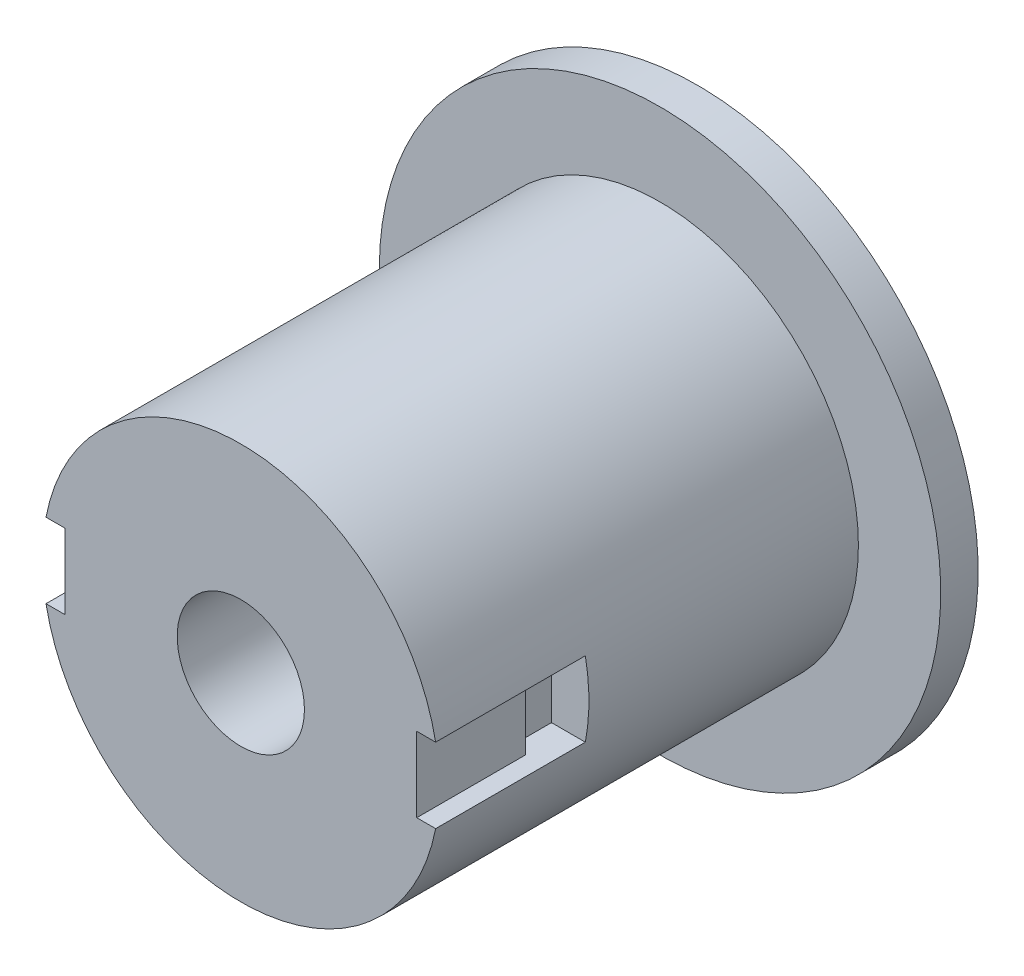
ISO-10303-21;
HEADER;
FILE_DESCRIPTION(('STEP AP214'),'2;1');
FILE_NAME('part.step','',(''),(''),'','','');
FILE_SCHEMA(('AUTOMOTIVE_DESIGN { 1 0 10303 214 1 1 1 1 }'));
ENDSEC;
DATA;
#1=APPLICATION_CONTEXT('core data for automotive mechanical design processes');
#2=APPLICATION_PROTOCOL_DEFINITION('international standard','automotive_design',2000,#1);
#3=PRODUCT_CONTEXT('',#1,'mechanical');
#4=PRODUCT('Part','Part','',(#3));
#5=PRODUCT_RELATED_PRODUCT_CATEGORY('part','',(#4));
#6=PRODUCT_DEFINITION_FORMATION('','',#4);
#7=PRODUCT_DEFINITION_CONTEXT('part definition',#1,'design');
#8=PRODUCT_DEFINITION('design','',#6,#7);
#9=PRODUCT_DEFINITION_SHAPE('','',#8);
#10=(LENGTH_UNIT() NAMED_UNIT(*) SI_UNIT(.MILLI.,.METRE.));
#11=(NAMED_UNIT(*) PLANE_ANGLE_UNIT() SI_UNIT($,.RADIAN.));
#12=(NAMED_UNIT(*) SI_UNIT($,.STERADIAN.) SOLID_ANGLE_UNIT());
#13=UNCERTAINTY_MEASURE_WITH_UNIT(LENGTH_MEASURE(1.E-05),#10,'distance_accuracy_value','');
#14=(GEOMETRIC_REPRESENTATION_CONTEXT(3) GLOBAL_UNCERTAINTY_ASSIGNED_CONTEXT((#13)) GLOBAL_UNIT_ASSIGNED_CONTEXT((#10,
#11,#12)) REPRESENTATION_CONTEXT('',''));
#15=CARTESIAN_POINT('',(0.,0.,0.));
#16=DIRECTION('',(0.,0.,1.));
#17=DIRECTION('',(1.,0.,0.));
#18=AXIS2_PLACEMENT_3D('',#15,#16,#17);
#19=CARTESIAN_POINT('',(0.,0.,56.));
#20=DIRECTION('',(0.,0.,-1.));
#21=DIRECTION('',(-1.,0.,0.));
#22=AXIS2_PLACEMENT_3D('',#19,#20,#21);
#23=CYLINDRICAL_SURFACE('',#22,26.5);
#24=CARTESIAN_POINT('',(0.,0.,36.));
#25=DIRECTION('',(0.,0.,-1.));
#26=DIRECTION('',(-1.,0.,0.));
#27=AXIS2_PLACEMENT_3D('',#24,#25,#26);
#28=CIRCLE('',#27,26.5);
#29=CARTESIAN_POINT('',(-26.0240273593462,-5.,36.));
#30=VERTEX_POINT('',#29);
#31=CARTESIAN_POINT('',(-26.0240273593462,5.,36.));
#32=VERTEX_POINT('',#31);
#33=EDGE_CURVE('E11',#30,#32,#28,.T.);
#34=ORIENTED_EDGE('',*,*,#33,.T.);
#35=DIRECTION('',(0.,0.,-1.));
#36=VECTOR('',#35,1.);
#37=CARTESIAN_POINT('',(-26.0240273593462,5.,56.));
#38=LINE('',#37,#36);
#39=CARTESIAN_POINT('',(-26.0240273593462,5.,56.));
#40=VERTEX_POINT('',#39);
#41=EDGE_CURVE('E145',#32,#40,#38,.F.);
#42=ORIENTED_EDGE('',*,*,#41,.T.);
#43=CARTESIAN_POINT('',(0.,0.,56.));
#44=DIRECTION('',(0.,0.,1.));
#45=DIRECTION('',(1.,0.,0.));
#46=AXIS2_PLACEMENT_3D('',#43,#44,#45);
#47=CIRCLE('',#46,26.5);
#48=CARTESIAN_POINT('',(26.0240273593462,5.,56.));
#49=VERTEX_POINT('',#48);
#50=EDGE_CURVE('E204',#49,#40,#47,.T.);
#51=ORIENTED_EDGE('',*,*,#50,.F.);
#52=DIRECTION('',(0.,0.,-1.));
#53=VECTOR('',#52,1.);
#54=CARTESIAN_POINT('',(26.0240273593462,5.,56.));
#55=LINE('',#54,#53);
#56=CARTESIAN_POINT('',(26.0240273593462,5.,36.));
#57=VERTEX_POINT('',#56);
#58=EDGE_CURVE('E185',#49,#57,#55,.T.);
#59=ORIENTED_EDGE('',*,*,#58,.T.);
#60=CARTESIAN_POINT('',(0.,0.,36.));
#61=DIRECTION('',(0.,0.,1.));
#62=DIRECTION('',(1.,0.,0.));
#63=AXIS2_PLACEMENT_3D('',#60,#61,#62);
#64=CIRCLE('',#63,26.5);
#65=CARTESIAN_POINT('',(26.0240273593462,-5.,36.));
#66=VERTEX_POINT('',#65);
#67=EDGE_CURVE('E40',#66,#57,#64,.T.);
#68=ORIENTED_EDGE('',*,*,#67,.F.);
#69=DIRECTION('',(0.,0.,-1.));
#70=VECTOR('',#69,1.);
#71=CARTESIAN_POINT('',(26.0240273593462,-5.,56.));
#72=LINE('',#71,#70);
#73=CARTESIAN_POINT('',(26.0240273593462,-5.,56.));
#74=VERTEX_POINT('',#73);
#75=EDGE_CURVE('E183',#74,#66,#72,.T.);
#76=ORIENTED_EDGE('',*,*,#75,.F.);
#77=CARTESIAN_POINT('',(-26.0240273593462,-5.,56.));
#78=VERTEX_POINT('',#77);
#79=EDGE_CURVE('E203',#78,#74,#47,.T.);
#80=ORIENTED_EDGE('',*,*,#79,.F.);
#81=DIRECTION('',(0.,0.,-1.));
#82=VECTOR('',#81,1.);
#83=CARTESIAN_POINT('',(-26.0240273593462,-5.,56.));
#84=LINE('',#83,#82);
#85=EDGE_CURVE('E47',#30,#78,#84,.F.);
#86=ORIENTED_EDGE('',*,*,#85,.F.);
#87=EDGE_LOOP('',(#34,#42,#51,#59,#68,#76,#80,#86));
#88=FACE_BOUND('',#87,.T.);
#89=CARTESIAN_POINT('',(0.,0.,0.));
#90=DIRECTION('',(0.,0.,-1.));
#91=DIRECTION('',(-1.,0.,0.));
#92=AXIS2_PLACEMENT_3D('',#89,#90,#91);
#93=CIRCLE('',#92,26.5);
#94=CARTESIAN_POINT('',(-26.5,0.,0.));
#95=VERTEX_POINT('',#94);
#96=EDGE_CURVE('E198',#95,#95,#93,.T.);
#97=ORIENTED_EDGE('',*,*,#96,.F.);
#98=EDGE_LOOP('',(#97));
#99=FACE_BOUND('',#98,.T.);
#100=ADVANCED_FACE('F33',(#88,#99),#23,.T.);
#101=CARTESIAN_POINT('',(0.,0.,56.));
#102=DIRECTION('',(0.,0.,1.));
#103=DIRECTION('',(1.,0.,0.));
#104=AXIS2_PLACEMENT_3D('',#101,#102,#103);
#105=PLANE('',#104);
#106=DIRECTION('',(-1.,0.,0.));
#107=VECTOR('',#106,1.);
#108=CARTESIAN_POINT('',(-23.5,5.,56.));
#109=LINE('',#108,#107);
#110=CARTESIAN_POINT('',(-23.5,5.,56.));
#111=VERTEX_POINT('',#110);
#112=EDGE_CURVE('E143',#111,#40,#109,.T.);
#113=ORIENTED_EDGE('',*,*,#112,.F.);
#114=DIRECTION('',(0.,-1.,0.));
#115=VECTOR('',#114,1.);
#116=CARTESIAN_POINT('',(-23.5,5.,56.));
#117=LINE('',#116,#115);
#118=CARTESIAN_POINT('',(-23.5,-5.,56.));
#119=VERTEX_POINT('',#118);
#120=EDGE_CURVE('E127',#111,#119,#117,.T.);
#121=ORIENTED_EDGE('',*,*,#120,.T.);
#122=DIRECTION('',(-1.,0.,0.));
#123=VECTOR('',#122,1.);
#124=CARTESIAN_POINT('',(-23.5,-5.,56.));
#125=LINE('',#124,#123);
#126=EDGE_CURVE('E133',#119,#78,#125,.T.);
#127=ORIENTED_EDGE('',*,*,#126,.T.);
#128=ORIENTED_EDGE('',*,*,#79,.T.);
#129=DIRECTION('',(1.,0.,0.));
#130=VECTOR('',#129,1.);
#131=CARTESIAN_POINT('',(23.5,-5.,56.));
#132=LINE('',#131,#130);
#133=CARTESIAN_POINT('',(23.5,-5.,56.));
#134=VERTEX_POINT('',#133);
#135=EDGE_CURVE('E161',#134,#74,#132,.T.);
#136=ORIENTED_EDGE('',*,*,#135,.F.);
#137=DIRECTION('',(0.,-1.,0.));
#138=VECTOR('',#137,1.);
#139=CARTESIAN_POINT('',(23.5,5.,56.));
#140=LINE('',#139,#138);
#141=CARTESIAN_POINT('',(23.5,5.,56.));
#142=VERTEX_POINT('',#141);
#143=EDGE_CURVE('E174',#142,#134,#140,.T.);
#144=ORIENTED_EDGE('',*,*,#143,.F.);
#145=DIRECTION('',(1.,0.,0.));
#146=VECTOR('',#145,1.);
#147=CARTESIAN_POINT('',(23.5,5.,56.));
#148=LINE('',#147,#146);
#149=EDGE_CURVE('E171',#142,#49,#148,.T.);
#150=ORIENTED_EDGE('',*,*,#149,.T.);
#151=ORIENTED_EDGE('',*,*,#50,.T.);
#152=EDGE_LOOP('',(#113,#121,#127,#128,#136,#144,#150,#151));
#153=FACE_BOUND('',#152,.T.);
#154=CARTESIAN_POINT('',(0.,0.,56.));
#155=DIRECTION('',(0.,0.,1.));
#156=DIRECTION('',(1.,0.,0.));
#157=AXIS2_PLACEMENT_3D('',#154,#155,#156);
#158=CIRCLE('',#157,8.5);
#159=CARTESIAN_POINT('',(8.5,0.,56.));
#160=VERTEX_POINT('',#159);
#161=EDGE_CURVE('E188',#160,#160,#158,.T.);
#162=ORIENTED_EDGE('',*,*,#161,.F.);
#163=EDGE_LOOP('',(#162));
#164=FACE_BOUND('',#163,.T.);
#165=ADVANCED_FACE('F140',(#153,#164),#105,.T.);
#166=CARTESIAN_POINT('',(0.,0.,0.));
#167=DIRECTION('',(0.,0.,-1.));
#168=DIRECTION('',(-1.,0.,0.));
#169=AXIS2_PLACEMENT_3D('',#166,#167,#168);
#170=PLANE('',#169);
#171=CARTESIAN_POINT('',(0.,0.,0.));
#172=DIRECTION('',(0.,0.,-1.));
#173=DIRECTION('',(-1.,0.,0.));
#174=AXIS2_PLACEMENT_3D('',#171,#172,#173);
#175=CIRCLE('',#174,37.5);
#176=CARTESIAN_POINT('',(-37.5,0.,0.));
#177=VERTEX_POINT('',#176);
#178=EDGE_CURVE('E192',#177,#177,#175,.T.);
#179=ORIENTED_EDGE('',*,*,#178,.F.);
#180=EDGE_LOOP('',(#179));
#181=FACE_BOUND('',#180,.T.);
#182=ORIENTED_EDGE('',*,*,#96,.T.);
#183=EDGE_LOOP('',(#182));
#184=FACE_BOUND('',#183,.T.);
#185=ADVANCED_FACE('F279',(#181,#184),#170,.F.);
#186=CARTESIAN_POINT('',(0.,0.,-5.));
#187=DIRECTION('',(0.,0.,1.));
#188=DIRECTION('',(1.,0.,0.));
#189=AXIS2_PLACEMENT_3D('',#186,#187,#188);
#190=CYLINDRICAL_SURFACE('',#189,37.5);
#191=CARTESIAN_POINT('',(0.,0.,-5.));
#192=DIRECTION('',(0.,0.,-1.));
#193=DIRECTION('',(-1.,0.,0.));
#194=AXIS2_PLACEMENT_3D('',#191,#192,#193);
#195=CIRCLE('',#194,37.5);
#196=CARTESIAN_POINT('',(-37.5,0.,-5.));
#197=VERTEX_POINT('',#196);
#198=EDGE_CURVE('E195',#197,#197,#195,.T.);
#199=ORIENTED_EDGE('',*,*,#198,.F.);
#200=EDGE_LOOP('',(#199));
#201=FACE_BOUND('',#200,.T.);
#202=ORIENTED_EDGE('',*,*,#178,.T.);
#203=EDGE_LOOP('',(#202));
#204=FACE_BOUND('',#203,.T.);
#205=ADVANCED_FACE('F283',(#201,#204),#190,.T.);
#206=CARTESIAN_POINT('',(0.,0.,-5.));
#207=DIRECTION('',(0.,0.,-1.));
#208=DIRECTION('',(-1.,0.,0.));
#209=AXIS2_PLACEMENT_3D('',#206,#207,#208);
#210=PLANE('',#209);
#211=CARTESIAN_POINT('',(0.,0.,-5.));
#212=DIRECTION('',(0.,0.,1.));
#213=DIRECTION('',(1.,0.,0.));
#214=AXIS2_PLACEMENT_3D('',#211,#212,#213);
#215=CIRCLE('',#214,8.5);
#216=CARTESIAN_POINT('',(8.5,0.,-5.));
#217=VERTEX_POINT('',#216);
#218=EDGE_CURVE('E189',#217,#217,#215,.T.);
#219=ORIENTED_EDGE('',*,*,#218,.T.);
#220=EDGE_LOOP('',(#219));
#221=FACE_BOUND('',#220,.T.);
#222=ORIENTED_EDGE('',*,*,#198,.T.);
#223=EDGE_LOOP('',(#222));
#224=FACE_BOUND('',#223,.T.);
#225=ADVANCED_FACE('F288',(#221,#224),#210,.T.);
#226=CARTESIAN_POINT('',(0.,0.,-5.));
#227=DIRECTION('',(0.,0.,1.));
#228=DIRECTION('',(1.,0.,0.));
#229=AXIS2_PLACEMENT_3D('',#226,#227,#228);
#230=CYLINDRICAL_SURFACE('',#229,8.5);
#231=CARTESIAN_POINT('',(8.5,0.,-5.));
#232=CARTESIAN_POINT('',(8.5,0.,-4.36458333333333));
#233=CARTESIAN_POINT('',(8.5,0.,-3.72916666666666));
#234=CARTESIAN_POINT('',(8.5,0.,-2.45833333333333));
#235=CARTESIAN_POINT('',(8.5,0.,-1.82291666666666));
#236=CARTESIAN_POINT('',(8.5,0.,-0.552083333333332));
#237=CARTESIAN_POINT('',(8.5,0.,0.083333333333335));
#238=CARTESIAN_POINT('',(8.5,0.,1.35416666666667));
#239=CARTESIAN_POINT('',(8.5,0.,1.98958333333333));
#240=CARTESIAN_POINT('',(8.5,0.,3.26041666666667));
#241=CARTESIAN_POINT('',(8.5,0.,3.89583333333333));
#242=CARTESIAN_POINT('',(8.5,0.,5.16666666666667));
#243=CARTESIAN_POINT('',(8.5,0.,5.80208333333333));
#244=CARTESIAN_POINT('',(8.5,0.,7.07291666666667));
#245=CARTESIAN_POINT('',(8.5,0.,7.70833333333333));
#246=CARTESIAN_POINT('',(8.5,0.,8.97916666666667));
#247=CARTESIAN_POINT('',(8.5,0.,9.61458333333333));
#248=CARTESIAN_POINT('',(8.5,0.,10.8854166666667));
#249=CARTESIAN_POINT('',(8.5,0.,11.5208333333333));
#250=CARTESIAN_POINT('',(8.5,0.,12.7916666666667));
#251=CARTESIAN_POINT('',(8.5,0.,13.4270833333333));
#252=CARTESIAN_POINT('',(8.5,0.,14.6979166666667));
#253=CARTESIAN_POINT('',(8.5,0.,15.3333333333333));
#254=CARTESIAN_POINT('',(8.5,0.,16.6041666666667));
#255=CARTESIAN_POINT('',(8.5,0.,17.2395833333333));
#256=CARTESIAN_POINT('',(8.5,0.,18.5104166666667));
#257=CARTESIAN_POINT('',(8.5,0.,19.1458333333333));
#258=CARTESIAN_POINT('',(8.5,0.,20.4166666666667));
#259=CARTESIAN_POINT('',(8.5,0.,21.0520833333333));
#260=CARTESIAN_POINT('',(8.5,0.,22.3229166666667));
#261=CARTESIAN_POINT('',(8.5,0.,22.9583333333333));
#262=CARTESIAN_POINT('',(8.5,0.,24.2291666666667));
#263=CARTESIAN_POINT('',(8.5,0.,24.8645833333333));
#264=CARTESIAN_POINT('',(8.5,0.,26.1354166666667));
#265=CARTESIAN_POINT('',(8.5,0.,26.7708333333333));
#266=CARTESIAN_POINT('',(8.5,0.,28.0416666666667));
#267=CARTESIAN_POINT('',(8.5,0.,28.6770833333333));
#268=CARTESIAN_POINT('',(8.5,0.,29.9479166666667));
#269=CARTESIAN_POINT('',(8.5,0.,30.5833333333333));
#270=CARTESIAN_POINT('',(8.5,0.,31.8541666666667));
#271=CARTESIAN_POINT('',(8.5,0.,32.4895833333333));
#272=CARTESIAN_POINT('',(8.5,0.,33.7604166666667));
#273=CARTESIAN_POINT('',(8.5,0.,34.3958333333333));
#274=CARTESIAN_POINT('',(8.5,0.,35.6666666666667));
#275=CARTESIAN_POINT('',(8.5,0.,36.3020833333333));
#276=CARTESIAN_POINT('',(8.5,0.,37.5729166666667));
#277=CARTESIAN_POINT('',(8.5,0.,38.2083333333333));
#278=CARTESIAN_POINT('',(8.5,0.,39.4791666666667));
#279=CARTESIAN_POINT('',(8.5,0.,40.1145833333333));
#280=CARTESIAN_POINT('',(8.5,0.,41.3854166666667));
#281=CARTESIAN_POINT('',(8.5,0.,42.0208333333333));
#282=CARTESIAN_POINT('',(8.5,0.,43.2916666666667));
#283=CARTESIAN_POINT('',(8.5,0.,43.9270833333333));
#284=CARTESIAN_POINT('',(8.5,0.,45.1979166666667));
#285=CARTESIAN_POINT('',(8.5,0.,45.8333333333333));
#286=CARTESIAN_POINT('',(8.5,0.,47.1041666666667));
#287=CARTESIAN_POINT('',(8.5,0.,47.7395833333333));
#288=CARTESIAN_POINT('',(8.5,0.,49.0104166666667));
#289=CARTESIAN_POINT('',(8.5,0.,49.6458333333333));
#290=CARTESIAN_POINT('',(8.5,0.,50.9166666666667));
#291=CARTESIAN_POINT('',(8.5,0.,51.5520833333333));
#292=CARTESIAN_POINT('',(8.5,0.,52.8229166666667));
#293=CARTESIAN_POINT('',(8.5,0.,53.4583333333333));
#294=CARTESIAN_POINT('',(8.5,0.,54.7291666666667));
#295=CARTESIAN_POINT('',(8.5,0.,55.3645833333333));
#296=CARTESIAN_POINT('',(8.5,0.,56.));
#297=B_SPLINE_CURVE_WITH_KNOTS('',3,(#231,#232,#233,#234,#235,#236,#237,#238,#239,#240,#241,
#242,#243,#244,#245,#246,#247,#248,#249,#250,#251,#252,#253,#254,#255,#256,#257,#258,#259,#260,
#261,#262,#263,#264,#265,#266,#267,#268,#269,#270,#271,#272,#273,#274,#275,#276,#277,#278,#279,
#280,#281,#282,#283,#284,#285,#286,#287,#288,#289,#290,#291,#292,#293,#294,#295,#296),
.UNSPECIFIED.,.F.,.F.,(4,2,2,2,2,2,2,2,2,2,2,2,2,2,2,2,2,2,2,2,2,2,2,2,2,2,2,2,2,2,2,2,4),(0.,
1.90625,3.8125,5.71875,7.625,9.53125,11.4375,13.34375,15.25,17.15625,19.0625,20.96875,22.875,
24.78125,26.6875,28.59375,30.5,32.40625,34.3125,36.21875,38.125,40.03125,41.9375,43.84375,45.75,
47.65625,49.5625,51.46875,53.375,55.28125,57.1875,59.09375,61.),.UNSPECIFIED.);
#298=EDGE_CURVE('BSEAM293',#217,#160,#297,.T.);
#299=ORIENTED_EDGE('',*,*,#218,.F.);
#300=ORIENTED_EDGE('',*,*,#161,.T.);
#301=ORIENTED_EDGE('',*,*,#298,.T.);
#302=ORIENTED_EDGE('',*,*,#298,.F.);
#303=EDGE_LOOP('',(#299,#301,#300,#302));
#304=FACE_BOUND('',#303,.T.);
#305=ADVANCED_FACE('F293',(#304),#230,.F.);
#306=CARTESIAN_POINT('',(26.5,5.,36.));
#307=DIRECTION('',(0.,0.,1.));
#308=DIRECTION('',(1.,0.,0.));
#309=AXIS2_PLACEMENT_3D('',#306,#307,#308);
#310=PLANE('',#309);
#311=ORIENTED_EDGE('',*,*,#67,.T.);
#312=DIRECTION('',(-1.,0.,0.));
#313=VECTOR('',#312,1.);
#314=CARTESIAN_POINT('',(26.5,5.,36.));
#315=LINE('',#314,#313);
#316=CARTESIAN_POINT('',(21.5,5.,36.));
#317=VERTEX_POINT('',#316);
#318=EDGE_CURVE('E163',#57,#317,#315,.T.);
#319=ORIENTED_EDGE('',*,*,#318,.T.);
#320=DIRECTION('',(0.,-1.,0.));
#321=VECTOR('',#320,1.);
#322=CARTESIAN_POINT('',(21.5,5.,36.));
#323=LINE('',#322,#321);
#324=CARTESIAN_POINT('',(21.5,-5.,36.));
#325=VERTEX_POINT('',#324);
#326=EDGE_CURVE('E180',#317,#325,#323,.T.);
#327=ORIENTED_EDGE('',*,*,#326,.T.);
#328=DIRECTION('',(-1.,0.,0.));
#329=VECTOR('',#328,1.);
#330=CARTESIAN_POINT('',(26.5,-5.,36.));
#331=LINE('',#330,#329);
#332=EDGE_CURVE('E153',#66,#325,#331,.T.);
#333=ORIENTED_EDGE('',*,*,#332,.F.);
#334=EDGE_LOOP('',(#311,#319,#327,#333));
#335=FACE_BOUND('',#334,.T.);
#336=ADVANCED_FACE('F209',(#335),#310,.T.);
#337=CARTESIAN_POINT('',(0.,5.,0.));
#338=DIRECTION('',(0.,1.,0.));
#339=DIRECTION('',(0.,0.,1.));
#340=AXIS2_PLACEMENT_3D('',#337,#338,#339);
#341=PLANE('',#340);
#342=ORIENTED_EDGE('',*,*,#149,.F.);
#343=DIRECTION('',(0.,0.,1.));
#344=VECTOR('',#343,1.);
#345=CARTESIAN_POINT('',(23.5,5.,41.5));
#346=LINE('',#345,#344);
#347=CARTESIAN_POINT('',(23.5,5.,41.5));
#348=VERTEX_POINT('',#347);
#349=EDGE_CURVE('E169',#348,#142,#346,.T.);
#350=ORIENTED_EDGE('',*,*,#349,.F.);
#351=DIRECTION('',(0.707106781186549,0.,0.707106781186546));
#352=VECTOR('',#351,1.);
#353=CARTESIAN_POINT('',(21.5,5.,39.5));
#354=LINE('',#353,#352);
#355=CARTESIAN_POINT('',(21.5,5.,39.5));
#356=VERTEX_POINT('',#355);
#357=EDGE_CURVE('E167',#356,#348,#354,.T.);
#358=ORIENTED_EDGE('',*,*,#357,.F.);
#359=DIRECTION('',(0.,0.,1.));
#360=VECTOR('',#359,1.);
#361=CARTESIAN_POINT('',(21.5,5.,36.));
#362=LINE('',#361,#360);
#363=EDGE_CURVE('E165',#317,#356,#362,.T.);
#364=ORIENTED_EDGE('',*,*,#363,.F.);
#365=ORIENTED_EDGE('',*,*,#318,.F.);
#366=ORIENTED_EDGE('',*,*,#58,.F.);
#367=EDGE_LOOP('',(#342,#350,#358,#364,#365,#366));
#368=FACE_BOUND('',#367,.T.);
#369=ADVANCED_FACE('F216',(#368),#341,.F.);
#370=CARTESIAN_POINT('',(0.,-5.,0.));
#371=DIRECTION('',(0.,1.,0.));
#372=DIRECTION('',(0.,0.,1.));
#373=AXIS2_PLACEMENT_3D('',#370,#371,#372);
#374=PLANE('',#373);
#375=ORIENTED_EDGE('',*,*,#75,.T.);
#376=ORIENTED_EDGE('',*,*,#332,.T.);
#377=DIRECTION('',(0.,0.,1.));
#378=VECTOR('',#377,1.);
#379=CARTESIAN_POINT('',(21.5,-5.,36.));
#380=LINE('',#379,#378);
#381=CARTESIAN_POINT('',(21.5,-5.,39.5));
#382=VERTEX_POINT('',#381);
#383=EDGE_CURVE('E155',#325,#382,#380,.T.);
#384=ORIENTED_EDGE('',*,*,#383,.T.);
#385=DIRECTION('',(0.707106781186549,0.,0.707106781186546));
#386=VECTOR('',#385,1.);
#387=CARTESIAN_POINT('',(21.5,-5.,39.5));
#388=LINE('',#387,#386);
#389=CARTESIAN_POINT('',(23.5,-5.,41.5));
#390=VERTEX_POINT('',#389);
#391=EDGE_CURVE('E158',#382,#390,#388,.T.);
#392=ORIENTED_EDGE('',*,*,#391,.T.);
#393=DIRECTION('',(0.,0.,1.));
#394=VECTOR('',#393,1.);
#395=CARTESIAN_POINT('',(23.5,-5.,41.5));
#396=LINE('',#395,#394);
#397=EDGE_CURVE('E55',#390,#134,#396,.T.);
#398=ORIENTED_EDGE('',*,*,#397,.T.);
#399=ORIENTED_EDGE('',*,*,#135,.T.);
#400=EDGE_LOOP('',(#375,#376,#384,#392,#398,#399));
#401=FACE_BOUND('',#400,.T.);
#402=ADVANCED_FACE('F234',(#401),#374,.T.);
#403=CARTESIAN_POINT('',(21.5,5.,36.));
#404=DIRECTION('',(1.,0.,0.));
#405=DIRECTION('',(0.,0.,-1.));
#406=AXIS2_PLACEMENT_3D('',#403,#404,#405);
#407=PLANE('',#406);
#408=ORIENTED_EDGE('',*,*,#326,.F.);
#409=ORIENTED_EDGE('',*,*,#363,.T.);
#410=DIRECTION('',(0.,-1.,0.));
#411=VECTOR('',#410,1.);
#412=CARTESIAN_POINT('',(21.5,5.,39.5));
#413=LINE('',#412,#411);
#414=EDGE_CURVE('E178',#356,#382,#413,.T.);
#415=ORIENTED_EDGE('',*,*,#414,.T.);
#416=ORIENTED_EDGE('',*,*,#383,.F.);
#417=EDGE_LOOP('',(#408,#409,#415,#416));
#418=FACE_BOUND('',#417,.T.);
#419=ADVANCED_FACE('F233',(#418),#407,.T.);
#420=CARTESIAN_POINT('',(21.5,5.,39.5));
#421=DIRECTION('',(0.707106781186546,0.,-0.707106781186549));
#422=DIRECTION('',(-0.707106781186549,0.,-0.707106781186546));
#423=AXIS2_PLACEMENT_3D('',#420,#421,#422);
#424=PLANE('',#423);
#425=ORIENTED_EDGE('',*,*,#414,.F.);
#426=ORIENTED_EDGE('',*,*,#357,.T.);
#427=DIRECTION('',(0.,-1.,0.));
#428=VECTOR('',#427,1.);
#429=CARTESIAN_POINT('',(23.5,5.,41.5));
#430=LINE('',#429,#428);
#431=EDGE_CURVE('E176',#348,#390,#430,.T.);
#432=ORIENTED_EDGE('',*,*,#431,.T.);
#433=ORIENTED_EDGE('',*,*,#391,.F.);
#434=EDGE_LOOP('',(#425,#426,#432,#433));
#435=FACE_BOUND('',#434,.T.);
#436=ADVANCED_FACE('F230',(#435),#424,.T.);
#437=CARTESIAN_POINT('',(23.5,5.,41.5));
#438=DIRECTION('',(1.,0.,0.));
#439=DIRECTION('',(0.,0.,-1.));
#440=AXIS2_PLACEMENT_3D('',#437,#438,#439);
#441=PLANE('',#440);
#442=ORIENTED_EDGE('',*,*,#431,.F.);
#443=ORIENTED_EDGE('',*,*,#349,.T.);
#444=ORIENTED_EDGE('',*,*,#143,.T.);
#445=ORIENTED_EDGE('',*,*,#397,.F.);
#446=EDGE_LOOP('',(#442,#443,#444,#445));
#447=FACE_BOUND('',#446,.T.);
#448=ADVANCED_FACE('F226',(#447),#441,.T.);
#449=CARTESIAN_POINT('',(-26.5,5.,36.));
#450=DIRECTION('',(0.,0.,-1.));
#451=DIRECTION('',(-1.,0.,0.));
#452=AXIS2_PLACEMENT_3D('',#449,#450,#451);
#453=PLANE('',#452);
#454=ORIENTED_EDGE('',*,*,#33,.F.);
#455=DIRECTION('',(1.,0.,0.));
#456=VECTOR('',#455,1.);
#457=CARTESIAN_POINT('',(-26.5,-5.,36.));
#458=LINE('',#457,#456);
#459=CARTESIAN_POINT('',(-21.5,-5.,36.));
#460=VERTEX_POINT('',#459);
#461=EDGE_CURVE('E261',#30,#460,#458,.T.);
#462=ORIENTED_EDGE('',*,*,#461,.T.);
#463=DIRECTION('',(0.,-1.,0.));
#464=VECTOR('',#463,1.);
#465=CARTESIAN_POINT('',(-21.5,5.,36.));
#466=LINE('',#465,#464);
#467=CARTESIAN_POINT('',(-21.5,5.,36.));
#468=VERTEX_POINT('',#467);
#469=EDGE_CURVE('E244',#468,#460,#466,.T.);
#470=ORIENTED_EDGE('',*,*,#469,.F.);
#471=DIRECTION('',(1.,0.,0.));
#472=VECTOR('',#471,1.);
#473=CARTESIAN_POINT('',(-26.5,5.,36.));
#474=LINE('',#473,#472);
#475=EDGE_CURVE('E240',#32,#468,#474,.T.);
#476=ORIENTED_EDGE('',*,*,#475,.F.);
#477=EDGE_LOOP('',(#454,#462,#470,#476));
#478=FACE_BOUND('',#477,.T.);
#479=ADVANCED_FACE('F242',(#478),#453,.F.);
#480=CARTESIAN_POINT('',(0.,5.,0.));
#481=DIRECTION('',(0.,1.,0.));
#482=DIRECTION('',(0.,0.,1.));
#483=AXIS2_PLACEMENT_3D('',#480,#481,#482);
#484=PLANE('',#483);
#485=ORIENTED_EDGE('',*,*,#475,.T.);
#486=DIRECTION('',(0.,0.,1.));
#487=VECTOR('',#486,1.);
#488=CARTESIAN_POINT('',(-21.5,5.,36.));
#489=LINE('',#488,#487);
#490=CARTESIAN_POINT('',(-21.5,5.,39.5));
#491=VERTEX_POINT('',#490);
#492=EDGE_CURVE('E246',#468,#491,#489,.T.);
#493=ORIENTED_EDGE('',*,*,#492,.T.);
#494=DIRECTION('',(-0.707106781186549,0.,0.707106781186546));
#495=VECTOR('',#494,1.);
#496=CARTESIAN_POINT('',(-21.5,5.,39.5));
#497=LINE('',#496,#495);
#498=CARTESIAN_POINT('',(-23.5,5.,41.5));
#499=VERTEX_POINT('',#498);
#500=EDGE_CURVE('E249',#491,#499,#497,.T.);
#501=ORIENTED_EDGE('',*,*,#500,.T.);
#502=DIRECTION('',(0.,0.,1.));
#503=VECTOR('',#502,1.);
#504=CARTESIAN_POINT('',(-23.5,5.,41.5));
#505=LINE('',#504,#503);
#506=EDGE_CURVE('E267',#499,#111,#505,.T.);
#507=ORIENTED_EDGE('',*,*,#506,.T.);
#508=ORIENTED_EDGE('',*,*,#112,.T.);
#509=ORIENTED_EDGE('',*,*,#41,.F.);
#510=EDGE_LOOP('',(#485,#493,#501,#507,#508,#509));
#511=FACE_BOUND('',#510,.T.);
#512=ADVANCED_FACE('F238',(#511),#484,.F.);
#513=CARTESIAN_POINT('',(0.,-5.,0.));
#514=DIRECTION('',(0.,1.,0.));
#515=DIRECTION('',(0.,0.,1.));
#516=AXIS2_PLACEMENT_3D('',#513,#514,#515);
#517=PLANE('',#516);
#518=ORIENTED_EDGE('',*,*,#85,.T.);
#519=ORIENTED_EDGE('',*,*,#126,.F.);
#520=DIRECTION('',(0.,0.,1.));
#521=VECTOR('',#520,1.);
#522=CARTESIAN_POINT('',(-23.5,-5.,41.5));
#523=LINE('',#522,#521);
#524=CARTESIAN_POINT('',(-23.5,-5.,41.5));
#525=VERTEX_POINT('',#524);
#526=EDGE_CURVE('E123',#525,#119,#523,.T.);
#527=ORIENTED_EDGE('',*,*,#526,.F.);
#528=DIRECTION('',(-0.707106781186549,0.,0.707106781186546));
#529=VECTOR('',#528,1.);
#530=CARTESIAN_POINT('',(-21.5,-5.,39.5));
#531=LINE('',#530,#529);
#532=CARTESIAN_POINT('',(-21.5,-5.,39.5));
#533=VERTEX_POINT('',#532);
#534=EDGE_CURVE('E132',#533,#525,#531,.T.);
#535=ORIENTED_EDGE('',*,*,#534,.F.);
#536=DIRECTION('',(0.,0.,1.));
#537=VECTOR('',#536,1.);
#538=CARTESIAN_POINT('',(-21.5,-5.,36.));
#539=LINE('',#538,#537);
#540=EDGE_CURVE('E259',#460,#533,#539,.T.);
#541=ORIENTED_EDGE('',*,*,#540,.F.);
#542=ORIENTED_EDGE('',*,*,#461,.F.);
#543=EDGE_LOOP('',(#518,#519,#527,#535,#541,#542));
#544=FACE_BOUND('',#543,.T.);
#545=ADVANCED_FACE('F135',(#544),#517,.T.);
#546=CARTESIAN_POINT('',(-23.5,5.,41.5));
#547=DIRECTION('',(1.,0.,0.));
#548=DIRECTION('',(0.,0.,-1.));
#549=AXIS2_PLACEMENT_3D('',#546,#547,#548);
#550=PLANE('',#549);
#551=ORIENTED_EDGE('',*,*,#120,.F.);
#552=ORIENTED_EDGE('',*,*,#506,.F.);
#553=DIRECTION('',(0.,-1.,0.));
#554=VECTOR('',#553,1.);
#555=CARTESIAN_POINT('',(-23.5,5.,41.5));
#556=LINE('',#555,#554);
#557=EDGE_CURVE('E129',#499,#525,#556,.T.);
#558=ORIENTED_EDGE('',*,*,#557,.T.);
#559=ORIENTED_EDGE('',*,*,#526,.T.);
#560=EDGE_LOOP('',(#551,#552,#558,#559));
#561=FACE_BOUND('',#560,.T.);
#562=ADVANCED_FACE('F124',(#561),#550,.F.);
#563=CARTESIAN_POINT('',(-21.5,5.,39.5));
#564=DIRECTION('',(0.707106781186546,0.,0.707106781186549));
#565=DIRECTION('',(0.707106781186549,0.,-0.707106781186546));
#566=AXIS2_PLACEMENT_3D('',#563,#564,#565);
#567=PLANE('',#566);
#568=ORIENTED_EDGE('',*,*,#557,.F.);
#569=ORIENTED_EDGE('',*,*,#500,.F.);
#570=DIRECTION('',(0.,-1.,0.));
#571=VECTOR('',#570,1.);
#572=CARTESIAN_POINT('',(-21.5,5.,39.5));
#573=LINE('',#572,#571);
#574=EDGE_CURVE('E147',#491,#533,#573,.T.);
#575=ORIENTED_EDGE('',*,*,#574,.T.);
#576=ORIENTED_EDGE('',*,*,#534,.T.);
#577=EDGE_LOOP('',(#568,#569,#575,#576));
#578=FACE_BOUND('',#577,.T.);
#579=ADVANCED_FACE('F255',(#578),#567,.F.);
#580=CARTESIAN_POINT('',(-21.5,5.,36.));
#581=DIRECTION('',(1.,0.,0.));
#582=DIRECTION('',(0.,0.,-1.));
#583=AXIS2_PLACEMENT_3D('',#580,#581,#582);
#584=PLANE('',#583);
#585=ORIENTED_EDGE('',*,*,#574,.F.);
#586=ORIENTED_EDGE('',*,*,#492,.F.);
#587=ORIENTED_EDGE('',*,*,#469,.T.);
#588=ORIENTED_EDGE('',*,*,#540,.T.);
#589=EDGE_LOOP('',(#585,#586,#587,#588));
#590=FACE_BOUND('',#589,.T.);
#591=ADVANCED_FACE('F260',(#590),#584,.F.);
#592=CLOSED_SHELL('',(#100,#165,#185,#205,#225,#305,#336,#369,#402,#419,#436,#448,#479,#512,
#545,#562,#579,#591));
#593=MANIFOLD_SOLID_BREP('B2',#592);
#594=ADVANCED_BREP_SHAPE_REPRESENTATION('',(#18,#593),#14);
#595=SHAPE_DEFINITION_REPRESENTATION(#9,#594);
ENDSEC;
END-ISO-10303-21;
